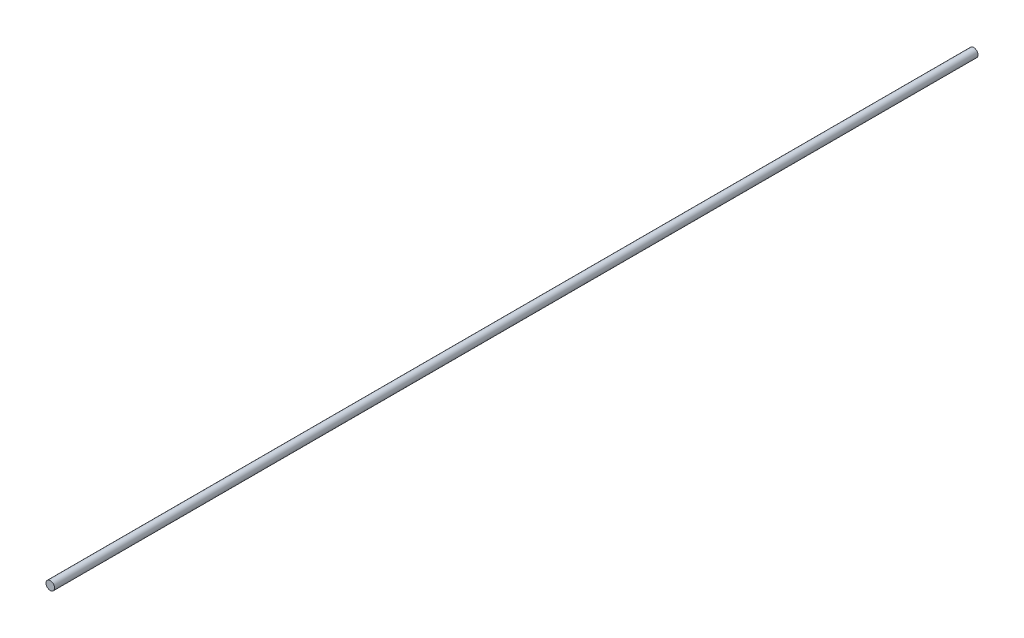
ISO-10303-21;
HEADER;
FILE_DESCRIPTION(('STEP AP214'),'2;1');
FILE_NAME('part.step','',(''),(''),'','','');
FILE_SCHEMA(('AUTOMOTIVE_DESIGN { 1 0 10303 214 1 1 1 1 }'));
ENDSEC;
DATA;
#1=APPLICATION_CONTEXT('core data for automotive mechanical design processes');
#2=APPLICATION_PROTOCOL_DEFINITION('international standard','automotive_design',2000,#1);
#3=PRODUCT_CONTEXT('',#1,'mechanical');
#4=PRODUCT('Part','Part','',(#3));
#5=PRODUCT_RELATED_PRODUCT_CATEGORY('part','',(#4));
#6=PRODUCT_DEFINITION_FORMATION('','',#4);
#7=PRODUCT_DEFINITION_CONTEXT('part definition',#1,'design');
#8=PRODUCT_DEFINITION('design','',#6,#7);
#9=PRODUCT_DEFINITION_SHAPE('','',#8);
#10=(LENGTH_UNIT() NAMED_UNIT(*) SI_UNIT(.MILLI.,.METRE.));
#11=(NAMED_UNIT(*) PLANE_ANGLE_UNIT() SI_UNIT($,.RADIAN.));
#12=(NAMED_UNIT(*) SI_UNIT($,.STERADIAN.) SOLID_ANGLE_UNIT());
#13=UNCERTAINTY_MEASURE_WITH_UNIT(LENGTH_MEASURE(1.E-05),#10,'distance_accuracy_value','');
#14=(GEOMETRIC_REPRESENTATION_CONTEXT(3) GLOBAL_UNCERTAINTY_ASSIGNED_CONTEXT((#13)) GLOBAL_UNIT_ASSIGNED_CONTEXT((#10,
#11,#12)) REPRESENTATION_CONTEXT('',''));
#15=CARTESIAN_POINT('',(0.,0.,0.));
#16=DIRECTION('',(0.,0.,1.));
#17=DIRECTION('',(1.,0.,0.));
#18=AXIS2_PLACEMENT_3D('',#15,#16,#17);
#19=CARTESIAN_POINT('',(0.,0.,254.));
#20=DIRECTION('',(0.,0.,-1.));
#21=DIRECTION('',(-1.,0.,0.));
#22=AXIS2_PLACEMENT_3D('',#19,#20,#21);
#23=CYLINDRICAL_SURFACE('',#22,1.1811);
#24=CARTESIAN_POINT('',(0.,0.,254.));
#25=DIRECTION('',(0.,0.,1.));
#26=DIRECTION('',(1.,0.,0.));
#27=AXIS2_PLACEMENT_3D('',#24,#25,#26);
#28=CIRCLE('',#27,1.1811);
#29=CARTESIAN_POINT('',(1.1811,0.,254.));
#30=VERTEX_POINT('',#29);
#31=EDGE_CURVE('E10',#30,#30,#28,.T.);
#32=ORIENTED_EDGE('',*,*,#31,.F.);
#33=EDGE_LOOP('',(#32));
#34=FACE_BOUND('',#33,.T.);
#35=CARTESIAN_POINT('',(0.,0.,0.));
#36=DIRECTION('',(0.,0.,1.));
#37=DIRECTION('',(1.,0.,0.));
#38=AXIS2_PLACEMENT_3D('',#35,#36,#37);
#39=CIRCLE('',#38,1.1811);
#40=CARTESIAN_POINT('',(1.1811,0.,0.));
#41=VERTEX_POINT('',#40);
#42=EDGE_CURVE('E34',#41,#41,#39,.T.);
#43=ORIENTED_EDGE('',*,*,#42,.T.);
#44=EDGE_LOOP('',(#43));
#45=FACE_BOUND('',#44,.T.);
#46=ADVANCED_FACE('F31',(#34,#45),#23,.T.);
#47=CARTESIAN_POINT('',(0.,0.,254.));
#48=DIRECTION('',(0.,0.,1.));
#49=DIRECTION('',(1.,0.,0.));
#50=AXIS2_PLACEMENT_3D('',#47,#48,#49);
#51=PLANE('',#50);
#52=ORIENTED_EDGE('',*,*,#31,.T.);
#53=EDGE_LOOP('',(#52));
#54=FACE_BOUND('',#53,.T.);
#55=ADVANCED_FACE('F46',(#54),#51,.T.);
#56=CARTESIAN_POINT('',(0.,0.,0.));
#57=DIRECTION('',(0.,0.,1.));
#58=DIRECTION('',(1.,0.,0.));
#59=AXIS2_PLACEMENT_3D('',#56,#57,#58);
#60=PLANE('',#59);
#61=ORIENTED_EDGE('',*,*,#42,.F.);
#62=EDGE_LOOP('',(#61));
#63=FACE_BOUND('',#62,.T.);
#64=ADVANCED_FACE('F44',(#63),#60,.F.);
#65=CLOSED_SHELL('',(#46,#55,#64));
#66=MANIFOLD_SOLID_BREP('B2',#65);
#67=ADVANCED_BREP_SHAPE_REPRESENTATION('',(#18,#66),#14);
#68=SHAPE_DEFINITION_REPRESENTATION(#9,#67);
ENDSEC;
END-ISO-10303-21;
